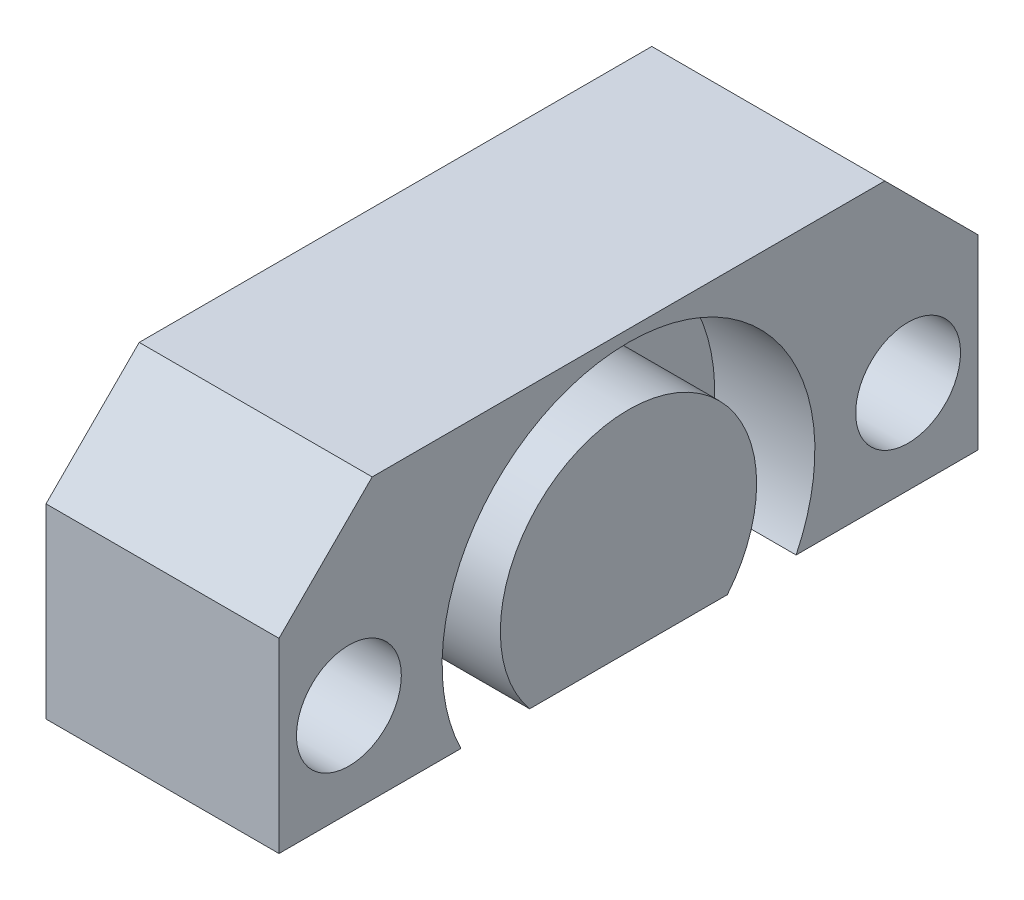
ISO-10303-21;
HEADER;
FILE_DESCRIPTION(('STEP AP214'),'2;1');
FILE_NAME('part.step','',(''),(''),'','','');
FILE_SCHEMA(('AUTOMOTIVE_DESIGN { 1 0 10303 214 1 1 1 1 }'));
ENDSEC;
DATA;
#1=APPLICATION_CONTEXT('core data for automotive mechanical design processes');
#2=APPLICATION_PROTOCOL_DEFINITION('international standard','automotive_design',2000,#1);
#3=PRODUCT_CONTEXT('',#1,'mechanical');
#4=PRODUCT('Part','Part','',(#3));
#5=PRODUCT_RELATED_PRODUCT_CATEGORY('part','',(#4));
#6=PRODUCT_DEFINITION_FORMATION('','',#4);
#7=PRODUCT_DEFINITION_CONTEXT('part definition',#1,'design');
#8=PRODUCT_DEFINITION('design','',#6,#7);
#9=PRODUCT_DEFINITION_SHAPE('','',#8);
#10=(LENGTH_UNIT() NAMED_UNIT(*) SI_UNIT(.MILLI.,.METRE.));
#11=(NAMED_UNIT(*) PLANE_ANGLE_UNIT() SI_UNIT($,.RADIAN.));
#12=(NAMED_UNIT(*) SI_UNIT($,.STERADIAN.) SOLID_ANGLE_UNIT());
#13=UNCERTAINTY_MEASURE_WITH_UNIT(LENGTH_MEASURE(1.E-05),#10,'distance_accuracy_value','');
#14=(GEOMETRIC_REPRESENTATION_CONTEXT(3) GLOBAL_UNCERTAINTY_ASSIGNED_CONTEXT((#13)) GLOBAL_UNIT_ASSIGNED_CONTEXT((#10,
#11,#12)) REPRESENTATION_CONTEXT('',''));
#15=CARTESIAN_POINT('',(0.,0.,0.));
#16=DIRECTION('',(0.,0.,1.));
#17=DIRECTION('',(1.,0.,0.));
#18=AXIS2_PLACEMENT_3D('',#15,#16,#17);
#19=CARTESIAN_POINT('',(10.,0.,0.));
#20=DIRECTION('',(1.,0.,0.));
#21=DIRECTION('',(0.,0.,-1.));
#22=AXIS2_PLACEMENT_3D('',#19,#20,#21);
#23=PLANE('',#22);
#24=DIRECTION('',(0.,0.,-1.));
#25=VECTOR('',#24,1.);
#26=CARTESIAN_POINT('',(10.,0.,15.));
#27=LINE('',#26,#25);
#28=CARTESIAN_POINT('',(10.,0.,4.24264068711929));
#29=VERTEX_POINT('',#28);
#30=CARTESIAN_POINT('',(10.,0.,-4.24264068711929));
#31=VERTEX_POINT('',#30);
#32=EDGE_CURVE('E189',#29,#31,#27,.T.);
#33=ORIENTED_EDGE('',*,*,#32,.T.);
#34=CARTESIAN_POINT('',(10.,3.5,0.));
#35=DIRECTION('',(1.,0.,0.));
#36=DIRECTION('',(0.,0.,-1.));
#37=AXIS2_PLACEMENT_3D('',#34,#35,#36);
#38=CIRCLE('',#37,5.5);
#39=EDGE_CURVE('E152',#31,#29,#38,.T.);
#40=ORIENTED_EDGE('',*,*,#39,.T.);
#41=EDGE_LOOP('',(#33,#40));
#42=FACE_BOUND('',#41,.T.);
#43=ADVANCED_FACE('F32',(#42),#23,.T.);
#44=CARTESIAN_POINT('',(10.,8.,15.));
#45=DIRECTION('',(0.,0.,-1.));
#46=DIRECTION('',(-1.,0.,0.));
#47=AXIS2_PLACEMENT_3D('',#44,#45,#46);
#48=PLANE('',#47);
#49=DIRECTION('',(0.,-1.,0.));
#50=VECTOR('',#49,1.);
#51=CARTESIAN_POINT('',(0.,8.,15.));
#52=LINE('',#51,#50);
#53=CARTESIAN_POINT('',(0.,8.,15.));
#54=VERTEX_POINT('',#53);
#55=CARTESIAN_POINT('',(0.,0.,15.));
#56=VERTEX_POINT('',#55);
#57=EDGE_CURVE('E131',#54,#56,#52,.T.);
#58=ORIENTED_EDGE('',*,*,#57,.T.);
#59=DIRECTION('',(-1.,0.,0.));
#60=VECTOR('',#59,1.);
#61=CARTESIAN_POINT('',(10.,0.,15.));
#62=LINE('',#61,#60);
#63=CARTESIAN_POINT('',(10.,0.,15.));
#64=VERTEX_POINT('',#63);
#65=EDGE_CURVE('E150',#64,#56,#62,.T.);
#66=ORIENTED_EDGE('',*,*,#65,.F.);
#67=DIRECTION('',(0.,-1.,0.));
#68=VECTOR('',#67,1.);
#69=CARTESIAN_POINT('',(10.,8.,15.));
#70=LINE('',#69,#68);
#71=CARTESIAN_POINT('',(10.,8.,15.));
#72=VERTEX_POINT('',#71);
#73=EDGE_CURVE('E143',#72,#64,#70,.T.);
#74=ORIENTED_EDGE('',*,*,#73,.F.);
#75=DIRECTION('',(-1.,0.,0.));
#76=VECTOR('',#75,1.);
#77=CARTESIAN_POINT('',(10.,8.,15.));
#78=LINE('',#77,#76);
#79=EDGE_CURVE('E127',#72,#54,#78,.T.);
#80=ORIENTED_EDGE('',*,*,#79,.T.);
#81=EDGE_LOOP('',(#58,#66,#74,#80));
#82=FACE_BOUND('',#81,.T.);
#83=ADVANCED_FACE('F34',(#82),#48,.F.);
#84=CARTESIAN_POINT('',(10.,0.,15.));
#85=DIRECTION('',(0.,1.,0.));
#86=DIRECTION('',(0.,0.,1.));
#87=AXIS2_PLACEMENT_3D('',#84,#85,#86);
#88=PLANE('',#87);
#89=DIRECTION('',(0.,0.,-1.));
#90=VECTOR('',#89,1.);
#91=CARTESIAN_POINT('',(5.7,0.,15.));
#92=LINE('',#91,#90);
#93=CARTESIAN_POINT('',(5.7,0.,7.19374728496908));
#94=VERTEX_POINT('',#93);
#95=CARTESIAN_POINT('',(5.7,0.,4.24264068711929));
#96=VERTEX_POINT('',#95);
#97=EDGE_CURVE('E11',#94,#96,#92,.T.);
#98=ORIENTED_EDGE('',*,*,#97,.F.);
#99=DIRECTION('',(1.,0.,0.));
#100=VECTOR('',#99,1.);
#101=CARTESIAN_POINT('',(5.7,0.,7.19374728496908));
#102=LINE('',#101,#100);
#103=CARTESIAN_POINT('',(10.,0.,7.19374728496908));
#104=VERTEX_POINT('',#103);
#105=EDGE_CURVE('E135',#94,#104,#102,.T.);
#106=ORIENTED_EDGE('',*,*,#105,.T.);
#107=EDGE_CURVE('E92',#64,#104,#27,.T.);
#108=ORIENTED_EDGE('',*,*,#107,.F.);
#109=ORIENTED_EDGE('',*,*,#65,.T.);
#110=DIRECTION('',(0.,0.,-1.));
#111=VECTOR('',#110,1.);
#112=CARTESIAN_POINT('',(0.,0.,15.));
#113=LINE('',#112,#111);
#114=CARTESIAN_POINT('',(0.,0.,-15.));
#115=VERTEX_POINT('',#114);
#116=EDGE_CURVE('E134',#56,#115,#113,.T.);
#117=ORIENTED_EDGE('',*,*,#116,.T.);
#118=DIRECTION('',(-1.,0.,0.));
#119=VECTOR('',#118,1.);
#120=CARTESIAN_POINT('',(10.,0.,-15.));
#121=LINE('',#120,#119);
#122=CARTESIAN_POINT('',(10.,0.,-15.));
#123=VERTEX_POINT('',#122);
#124=EDGE_CURVE('E147',#123,#115,#121,.T.);
#125=ORIENTED_EDGE('',*,*,#124,.F.);
#126=CARTESIAN_POINT('',(10.,0.,-7.19374728496908));
#127=VERTEX_POINT('',#126);
#128=EDGE_CURVE('E182',#127,#123,#27,.T.);
#129=ORIENTED_EDGE('',*,*,#128,.F.);
#130=DIRECTION('',(1.,0.,0.));
#131=VECTOR('',#130,1.);
#132=CARTESIAN_POINT('',(5.7,0.,-7.19374728496908));
#133=LINE('',#132,#131);
#134=CARTESIAN_POINT('',(5.7,0.,-7.19374728496908));
#135=VERTEX_POINT('',#134);
#136=EDGE_CURVE('E176',#127,#135,#133,.F.);
#137=ORIENTED_EDGE('',*,*,#136,.T.);
#138=CARTESIAN_POINT('',(5.7,0.,-4.24264068711929));
#139=VERTEX_POINT('',#138);
#140=EDGE_CURVE('E36',#139,#135,#92,.T.);
#141=ORIENTED_EDGE('',*,*,#140,.F.);
#142=DIRECTION('',(1.,0.,0.));
#143=VECTOR('',#142,1.);
#144=CARTESIAN_POINT('',(5.7,0.,-4.24264068711929));
#145=LINE('',#144,#143);
#146=EDGE_CURVE('E177',#31,#139,#145,.F.);
#147=ORIENTED_EDGE('',*,*,#146,.F.);
#148=ORIENTED_EDGE('',*,*,#32,.F.);
#149=DIRECTION('',(1.,0.,0.));
#150=VECTOR('',#149,1.);
#151=CARTESIAN_POINT('',(5.7,0.,4.24264068711929));
#152=LINE('',#151,#150);
#153=EDGE_CURVE('E47',#96,#29,#152,.T.);
#154=ORIENTED_EDGE('',*,*,#153,.F.);
#155=EDGE_LOOP('',(#98,#106,#108,#109,#117,#125,#129,#137,#141,#147,#148,#154));
#156=FACE_BOUND('',#155,.T.);
#157=ADVANCED_FACE('F180',(#156),#88,.F.);
#158=CARTESIAN_POINT('',(10.,0.,-15.));
#159=DIRECTION('',(0.,0.,1.));
#160=DIRECTION('',(0.,-1.,0.));
#161=AXIS2_PLACEMENT_3D('',#158,#159,#160);
#162=PLANE('',#161);
#163=DIRECTION('',(0.,1.,0.));
#164=VECTOR('',#163,1.);
#165=CARTESIAN_POINT('',(0.,0.,-15.));
#166=LINE('',#165,#164);
#167=CARTESIAN_POINT('',(0.,8.,-15.));
#168=VERTEX_POINT('',#167);
#169=EDGE_CURVE('E137',#115,#168,#166,.T.);
#170=ORIENTED_EDGE('',*,*,#169,.T.);
#171=DIRECTION('',(-1.,0.,0.));
#172=VECTOR('',#171,1.);
#173=CARTESIAN_POINT('',(10.,8.,-15.));
#174=LINE('',#173,#172);
#175=CARTESIAN_POINT('',(10.,8.,-15.));
#176=VERTEX_POINT('',#175);
#177=EDGE_CURVE('E122',#176,#168,#174,.T.);
#178=ORIENTED_EDGE('',*,*,#177,.F.);
#179=DIRECTION('',(0.,1.,0.));
#180=VECTOR('',#179,1.);
#181=CARTESIAN_POINT('',(10.,0.,-15.));
#182=LINE('',#181,#180);
#183=EDGE_CURVE('E110',#123,#176,#182,.T.);
#184=ORIENTED_EDGE('',*,*,#183,.F.);
#185=ORIENTED_EDGE('',*,*,#124,.T.);
#186=EDGE_LOOP('',(#170,#178,#184,#185));
#187=FACE_BOUND('',#186,.T.);
#188=ADVANCED_FACE('F193',(#187),#162,.F.);
#189=CARTESIAN_POINT('',(10.,8.,-15.));
#190=DIRECTION('',(0.,-0.707106781186548,0.707106781186547));
#191=DIRECTION('',(0.,-0.707106781186547,-0.707106781186548));
#192=AXIS2_PLACEMENT_3D('',#189,#190,#191);
#193=PLANE('',#192);
#194=DIRECTION('',(0.,0.707106781186547,0.707106781186548));
#195=VECTOR('',#194,1.);
#196=CARTESIAN_POINT('',(0.,8.,-15.));
#197=LINE('',#196,#195);
#198=CARTESIAN_POINT('',(0.,12.,-11.));
#199=VERTEX_POINT('',#198);
#200=EDGE_CURVE('E119',#168,#199,#197,.T.);
#201=ORIENTED_EDGE('',*,*,#200,.T.);
#202=DIRECTION('',(-1.,0.,0.));
#203=VECTOR('',#202,1.);
#204=CARTESIAN_POINT('',(10.,12.,-11.));
#205=LINE('',#204,#203);
#206=CARTESIAN_POINT('',(10.,12.,-11.));
#207=VERTEX_POINT('',#206);
#208=EDGE_CURVE('E116',#207,#199,#205,.T.);
#209=ORIENTED_EDGE('',*,*,#208,.F.);
#210=DIRECTION('',(0.,0.707106781186547,0.707106781186548));
#211=VECTOR('',#210,1.);
#212=CARTESIAN_POINT('',(10.,8.,-15.));
#213=LINE('',#212,#211);
#214=EDGE_CURVE('E102',#176,#207,#213,.T.);
#215=ORIENTED_EDGE('',*,*,#214,.F.);
#216=ORIENTED_EDGE('',*,*,#177,.T.);
#217=EDGE_LOOP('',(#201,#209,#215,#216));
#218=FACE_BOUND('',#217,.T.);
#219=ADVANCED_FACE('F117',(#218),#193,.F.);
#220=CARTESIAN_POINT('',(10.,12.,-11.));
#221=DIRECTION('',(0.,-1.,0.));
#222=DIRECTION('',(0.,0.,-1.));
#223=AXIS2_PLACEMENT_3D('',#220,#221,#222);
#224=PLANE('',#223);
#225=DIRECTION('',(0.,0.,1.));
#226=VECTOR('',#225,1.);
#227=CARTESIAN_POINT('',(0.,12.,-11.));
#228=LINE('',#227,#226);
#229=CARTESIAN_POINT('',(0.,12.,11.));
#230=VERTEX_POINT('',#229);
#231=EDGE_CURVE('E140',#199,#230,#228,.T.);
#232=ORIENTED_EDGE('',*,*,#231,.T.);
#233=DIRECTION('',(-1.,0.,0.));
#234=VECTOR('',#233,1.);
#235=CARTESIAN_POINT('',(10.,12.,11.));
#236=LINE('',#235,#234);
#237=CARTESIAN_POINT('',(10.,12.,11.));
#238=VERTEX_POINT('',#237);
#239=EDGE_CURVE('E123',#238,#230,#236,.T.);
#240=ORIENTED_EDGE('',*,*,#239,.F.);
#241=DIRECTION('',(0.,0.,1.));
#242=VECTOR('',#241,1.);
#243=CARTESIAN_POINT('',(10.,12.,-11.));
#244=LINE('',#243,#242);
#245=EDGE_CURVE('E107',#207,#238,#244,.T.);
#246=ORIENTED_EDGE('',*,*,#245,.F.);
#247=ORIENTED_EDGE('',*,*,#208,.T.);
#248=EDGE_LOOP('',(#232,#240,#246,#247));
#249=FACE_BOUND('',#248,.T.);
#250=ADVANCED_FACE('F125',(#249),#224,.F.);
#251=CARTESIAN_POINT('',(10.,12.,11.));
#252=DIRECTION('',(0.,-0.707106781186548,-0.707106781186548));
#253=DIRECTION('',(0.,0.707106781186548,-0.707106781186548));
#254=AXIS2_PLACEMENT_3D('',#251,#252,#253);
#255=PLANE('',#254);
#256=DIRECTION('',(0.,-0.707106781186548,0.707106781186548));
#257=VECTOR('',#256,1.);
#258=CARTESIAN_POINT('',(0.,12.,11.));
#259=LINE('',#258,#257);
#260=EDGE_CURVE('E83',#230,#54,#259,.T.);
#261=ORIENTED_EDGE('',*,*,#260,.T.);
#262=ORIENTED_EDGE('',*,*,#79,.F.);
#263=DIRECTION('',(0.,-0.707106781186548,0.707106781186548));
#264=VECTOR('',#263,1.);
#265=CARTESIAN_POINT('',(10.,12.,11.));
#266=LINE('',#265,#264);
#267=EDGE_CURVE('E56',#238,#72,#266,.T.);
#268=ORIENTED_EDGE('',*,*,#267,.F.);
#269=ORIENTED_EDGE('',*,*,#239,.T.);
#270=EDGE_LOOP('',(#261,#262,#268,#269));
#271=FACE_BOUND('',#270,.T.);
#272=ADVANCED_FACE('F197',(#271),#255,.F.);
#273=CARTESIAN_POINT('',(10.,4.,-12.));
#274=DIRECTION('',(1.,0.,0.));
#275=DIRECTION('',(0.,0.,-1.));
#276=AXIS2_PLACEMENT_3D('',#273,#274,#275);
#277=CIRCLE('',#276,2.25);
#278=CARTESIAN_POINT('',(10.,4.,-14.25));
#279=VERTEX_POINT('',#278);
#280=EDGE_CURVE('E223',#279,#279,#277,.T.);
#281=ORIENTED_EDGE('',*,*,#280,.F.);
#282=EDGE_LOOP('',(#281));
#283=FACE_BOUND('',#282,.T.);
#284=CARTESIAN_POINT('',(10.,4.,12.));
#285=DIRECTION('',(1.,0.,0.));
#286=DIRECTION('',(0.,0.,-1.));
#287=AXIS2_PLACEMENT_3D('',#284,#285,#286);
#288=CIRCLE('',#287,2.25);
#289=CARTESIAN_POINT('',(10.,4.,9.75));
#290=VERTEX_POINT('',#289);
#291=EDGE_CURVE('E226',#290,#290,#288,.T.);
#292=ORIENTED_EDGE('',*,*,#291,.F.);
#293=EDGE_LOOP('',(#292));
#294=FACE_BOUND('',#293,.T.);
#295=CARTESIAN_POINT('',(10.,3.5,0.));
#296=DIRECTION('',(1.,0.,0.));
#297=DIRECTION('',(0.,0.,-1.));
#298=AXIS2_PLACEMENT_3D('',#295,#296,#297);
#299=CIRCLE('',#298,8.);
#300=EDGE_CURVE('E153',#127,#104,#299,.T.);
#301=ORIENTED_EDGE('',*,*,#300,.F.);
#302=ORIENTED_EDGE('',*,*,#128,.T.);
#303=ORIENTED_EDGE('',*,*,#183,.T.);
#304=ORIENTED_EDGE('',*,*,#214,.T.);
#305=ORIENTED_EDGE('',*,*,#245,.T.);
#306=ORIENTED_EDGE('',*,*,#267,.T.);
#307=ORIENTED_EDGE('',*,*,#73,.T.);
#308=ORIENTED_EDGE('',*,*,#107,.T.);
#309=EDGE_LOOP('',(#301,#302,#303,#304,#305,#306,#307,#308));
#310=FACE_BOUND('',#309,.T.);
#311=ADVANCED_FACE('F105',(#283,#294,#310),#23,.T.);
#312=CARTESIAN_POINT('',(0.,0.,0.));
#313=DIRECTION('',(1.,0.,0.));
#314=DIRECTION('',(0.,0.,-1.));
#315=AXIS2_PLACEMENT_3D('',#312,#313,#314);
#316=PLANE('',#315);
#317=CARTESIAN_POINT('',(0.,4.,-12.));
#318=DIRECTION('',(1.,0.,0.));
#319=DIRECTION('',(0.,0.,-1.));
#320=AXIS2_PLACEMENT_3D('',#317,#318,#319);
#321=CIRCLE('',#320,2.25);
#322=CARTESIAN_POINT('',(0.,4.,-14.25));
#323=VERTEX_POINT('',#322);
#324=EDGE_CURVE('E229',#323,#323,#321,.T.);
#325=ORIENTED_EDGE('',*,*,#324,.T.);
#326=EDGE_LOOP('',(#325));
#327=FACE_BOUND('',#326,.T.);
#328=CARTESIAN_POINT('',(0.,4.,12.));
#329=DIRECTION('',(1.,0.,0.));
#330=DIRECTION('',(0.,0.,-1.));
#331=AXIS2_PLACEMENT_3D('',#328,#329,#330);
#332=CIRCLE('',#331,2.25);
#333=CARTESIAN_POINT('',(0.,4.,9.75));
#334=VERTEX_POINT('',#333);
#335=EDGE_CURVE('E228',#334,#334,#332,.T.);
#336=ORIENTED_EDGE('',*,*,#335,.T.);
#337=EDGE_LOOP('',(#336));
#338=FACE_BOUND('',#337,.T.);
#339=ORIENTED_EDGE('',*,*,#57,.F.);
#340=ORIENTED_EDGE('',*,*,#260,.F.);
#341=ORIENTED_EDGE('',*,*,#231,.F.);
#342=ORIENTED_EDGE('',*,*,#200,.F.);
#343=ORIENTED_EDGE('',*,*,#169,.F.);
#344=ORIENTED_EDGE('',*,*,#116,.F.);
#345=EDGE_LOOP('',(#339,#340,#341,#342,#343,#344));
#346=FACE_BOUND('',#345,.T.);
#347=ADVANCED_FACE('F196',(#327,#338,#346),#316,.F.);
#348=CARTESIAN_POINT('',(5.7,3.5,0.));
#349=DIRECTION('',(1.,0.,0.));
#350=DIRECTION('',(0.,0.,-1.));
#351=AXIS2_PLACEMENT_3D('',#348,#349,#350);
#352=PLANE('',#351);
#353=ORIENTED_EDGE('',*,*,#97,.T.);
#354=CARTESIAN_POINT('',(5.7,3.5,0.));
#355=DIRECTION('',(1.,0.,0.));
#356=DIRECTION('',(0.,0.,-1.));
#357=AXIS2_PLACEMENT_3D('',#354,#355,#356);
#358=CIRCLE('',#357,5.5);
#359=EDGE_CURVE('E171',#139,#96,#358,.T.);
#360=ORIENTED_EDGE('',*,*,#359,.F.);
#361=ORIENTED_EDGE('',*,*,#140,.T.);
#362=CARTESIAN_POINT('',(5.7,3.5,0.));
#363=DIRECTION('',(1.,0.,0.));
#364=DIRECTION('',(0.,0.,-1.));
#365=AXIS2_PLACEMENT_3D('',#362,#363,#364);
#366=CIRCLE('',#365,8.);
#367=EDGE_CURVE('E168',#135,#94,#366,.T.);
#368=ORIENTED_EDGE('',*,*,#367,.T.);
#369=EDGE_LOOP('',(#353,#360,#361,#368));
#370=FACE_BOUND('',#369,.T.);
#371=ADVANCED_FACE('F166',(#370),#352,.T.);
#372=CARTESIAN_POINT('',(5.7,3.5,0.));
#373=DIRECTION('',(1.,0.,0.));
#374=DIRECTION('',(0.,0.,-1.));
#375=AXIS2_PLACEMENT_3D('',#372,#373,#374);
#376=CYLINDRICAL_SURFACE('',#375,8.);
#377=ORIENTED_EDGE('',*,*,#367,.F.);
#378=ORIENTED_EDGE('',*,*,#136,.F.);
#379=ORIENTED_EDGE('',*,*,#300,.T.);
#380=ORIENTED_EDGE('',*,*,#105,.F.);
#381=EDGE_LOOP('',(#377,#378,#379,#380));
#382=FACE_BOUND('',#381,.T.);
#383=ADVANCED_FACE('F175',(#382),#376,.F.);
#384=CARTESIAN_POINT('',(5.7,3.5,0.));
#385=DIRECTION('',(1.,0.,0.));
#386=DIRECTION('',(0.,0.,-1.));
#387=AXIS2_PLACEMENT_3D('',#384,#385,#386);
#388=CYLINDRICAL_SURFACE('',#387,5.5);
#389=ORIENTED_EDGE('',*,*,#153,.T.);
#390=ORIENTED_EDGE('',*,*,#39,.F.);
#391=ORIENTED_EDGE('',*,*,#146,.T.);
#392=ORIENTED_EDGE('',*,*,#359,.T.);
#393=EDGE_LOOP('',(#389,#390,#391,#392));
#394=FACE_BOUND('',#393,.T.);
#395=ADVANCED_FACE('F238',(#394),#388,.T.);
#396=CARTESIAN_POINT('',(0.,4.,12.));
#397=DIRECTION('',(1.,0.,0.));
#398=DIRECTION('',(0.,0.,-1.));
#399=AXIS2_PLACEMENT_3D('',#396,#397,#398);
#400=CYLINDRICAL_SURFACE('',#399,2.25);
#401=ORIENTED_EDGE('',*,*,#335,.F.);
#402=EDGE_LOOP('',(#401));
#403=FACE_BOUND('',#402,.T.);
#404=ORIENTED_EDGE('',*,*,#291,.T.);
#405=EDGE_LOOP('',(#404));
#406=FACE_BOUND('',#405,.T.);
#407=ADVANCED_FACE('F247',(#403,#406),#400,.F.);
#408=CARTESIAN_POINT('',(0.,4.,-12.));
#409=DIRECTION('',(1.,0.,0.));
#410=DIRECTION('',(0.,0.,-1.));
#411=AXIS2_PLACEMENT_3D('',#408,#409,#410);
#412=CYLINDRICAL_SURFACE('',#411,2.25);
#413=ORIENTED_EDGE('',*,*,#324,.F.);
#414=EDGE_LOOP('',(#413));
#415=FACE_BOUND('',#414,.T.);
#416=ORIENTED_EDGE('',*,*,#280,.T.);
#417=EDGE_LOOP('',(#416));
#418=FACE_BOUND('',#417,.T.);
#419=ADVANCED_FACE('F253',(#415,#418),#412,.F.);
#420=CLOSED_SHELL('',(#43,#83,#157,#188,#219,#250,#272,#311,#347,#371,#383,#395,#407,#419));
#421=MANIFOLD_SOLID_BREP('B2',#420);
#422=ADVANCED_BREP_SHAPE_REPRESENTATION('',(#18,#421),#14);
#423=SHAPE_DEFINITION_REPRESENTATION(#9,#422);
ENDSEC;
END-ISO-10303-21;
